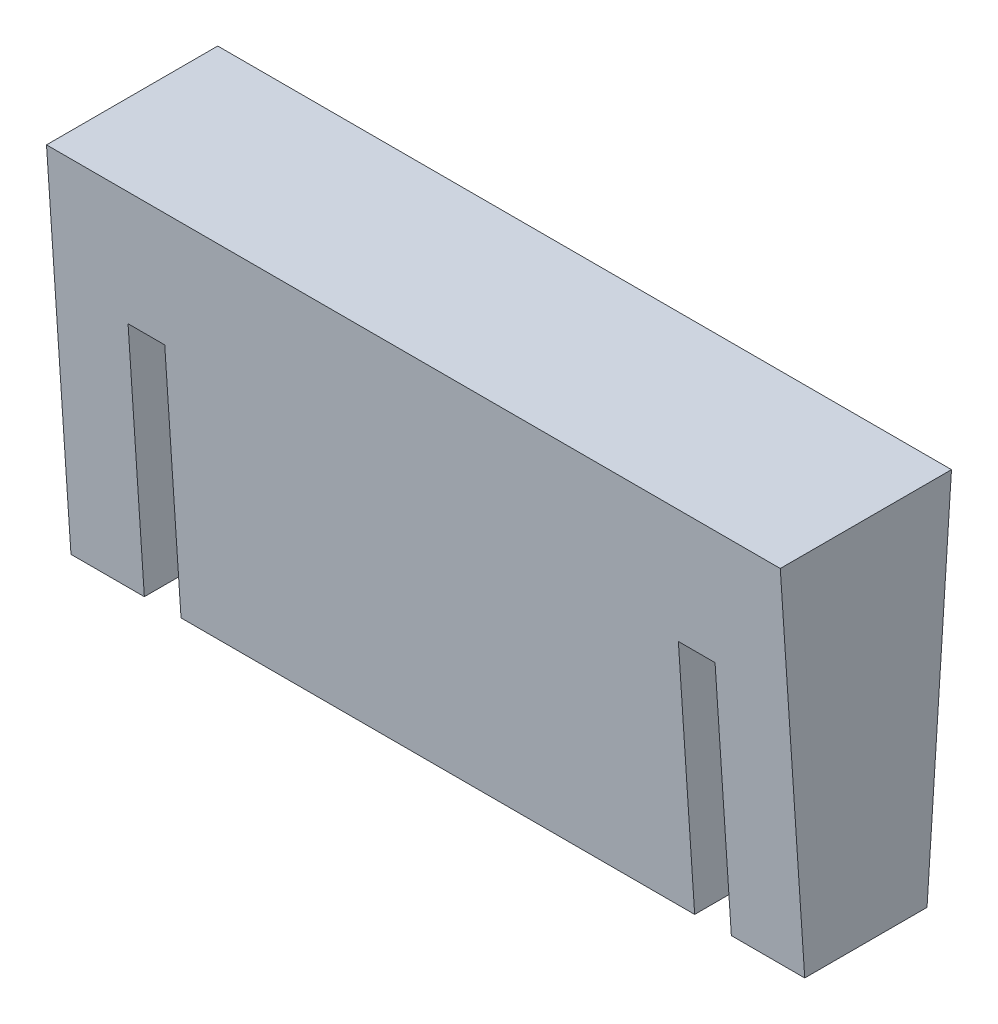
ISO-10303-21;
HEADER;
FILE_DESCRIPTION(('STEP AP214'),'2;1');
FILE_NAME('part.step','',(''),(''),'','','');
FILE_SCHEMA(('AUTOMOTIVE_DESIGN { 1 0 10303 214 1 1 1 1 }'));
ENDSEC;
DATA;
#1=APPLICATION_CONTEXT('core data for automotive mechanical design processes');
#2=APPLICATION_PROTOCOL_DEFINITION('international standard','automotive_design',2000,#1);
#3=PRODUCT_CONTEXT('',#1,'mechanical');
#4=PRODUCT('Part','Part','',(#3));
#5=PRODUCT_RELATED_PRODUCT_CATEGORY('part','',(#4));
#6=PRODUCT_DEFINITION_FORMATION('','',#4);
#7=PRODUCT_DEFINITION_CONTEXT('part definition',#1,'design');
#8=PRODUCT_DEFINITION('design','',#6,#7);
#9=PRODUCT_DEFINITION_SHAPE('','',#8);
#10=(LENGTH_UNIT() NAMED_UNIT(*) SI_UNIT(.MILLI.,.METRE.));
#11=(NAMED_UNIT(*) PLANE_ANGLE_UNIT() SI_UNIT($,.RADIAN.));
#12=(NAMED_UNIT(*) SI_UNIT($,.STERADIAN.) SOLID_ANGLE_UNIT());
#13=UNCERTAINTY_MEASURE_WITH_UNIT(LENGTH_MEASURE(1.E-05),#10,'distance_accuracy_value','');
#14=(GEOMETRIC_REPRESENTATION_CONTEXT(3) GLOBAL_UNCERTAINTY_ASSIGNED_CONTEXT((#13)) GLOBAL_UNIT_ASSIGNED_CONTEXT((#10,
#11,#12)) REPRESENTATION_CONTEXT('',''));
#15=CARTESIAN_POINT('',(0.,0.,0.));
#16=DIRECTION('',(0.,0.,1.));
#17=DIRECTION('',(1.,0.,0.));
#18=AXIS2_PLACEMENT_3D('',#15,#16,#17);
#19=CARTESIAN_POINT('',(0.,0.,0.));
#20=DIRECTION('',(0.,1.,0.));
#21=DIRECTION('',(0.,0.,1.));
#22=AXIS2_PLACEMENT_3D('',#19,#20,#21);
#23=PLANE('',#22);
#24=DIRECTION('',(0.,0.,1.));
#25=VECTOR('',#24,1.);
#26=CARTESIAN_POINT('',(-30.,0.,-7.));
#27=LINE('',#26,#25);
#28=CARTESIAN_POINT('',(-30.,0.,-5.));
#29=VERTEX_POINT('',#28);
#30=CARTESIAN_POINT('',(-30.,0.,5.00000000000001));
#31=VERTEX_POINT('',#30);
#32=EDGE_CURVE('E144',#29,#31,#27,.T.);
#33=ORIENTED_EDGE('',*,*,#32,.F.);
#34=DIRECTION('',(-1.,0.,0.));
#35=VECTOR('',#34,1.);
#36=CARTESIAN_POINT('',(30.,0.,-5.));
#37=LINE('',#36,#35);
#38=CARTESIAN_POINT('',(-24.,0.,-5.));
#39=VERTEX_POINT('',#38);
#40=EDGE_CURVE('E130',#39,#29,#37,.T.);
#41=ORIENTED_EDGE('',*,*,#40,.F.);
#42=DIRECTION('',(0.,0.,1.));
#43=VECTOR('',#42,1.);
#44=CARTESIAN_POINT('',(-24.,0.,-7.));
#45=LINE('',#44,#43);
#46=CARTESIAN_POINT('',(-24.,0.,5.00000000000001));
#47=VERTEX_POINT('',#46);
#48=EDGE_CURVE('E179',#39,#47,#45,.T.);
#49=ORIENTED_EDGE('',*,*,#48,.T.);
#50=DIRECTION('',(-1.,0.,0.));
#51=VECTOR('',#50,1.);
#52=CARTESIAN_POINT('',(30.,0.,5.00000000000001));
#53=LINE('',#52,#51);
#54=EDGE_CURVE('E214',#47,#31,#53,.T.);
#55=ORIENTED_EDGE('',*,*,#54,.T.);
#56=EDGE_LOOP('',(#33,#41,#49,#55));
#57=FACE_BOUND('',#56,.T.);
#58=ADVANCED_FACE('F33',(#57),#23,.F.);
#59=DIRECTION('',(0.,0.,1.));
#60=VECTOR('',#59,1.);
#61=CARTESIAN_POINT('',(24.,0.,-7.));
#62=LINE('',#61,#60);
#63=CARTESIAN_POINT('',(24.,0.,-5.));
#64=VERTEX_POINT('',#63);
#65=CARTESIAN_POINT('',(24.,0.,5.00000000000001));
#66=VERTEX_POINT('',#65);
#67=EDGE_CURVE('E140',#64,#66,#62,.T.);
#68=ORIENTED_EDGE('',*,*,#67,.F.);
#69=CARTESIAN_POINT('',(30.,0.,-5.));
#70=VERTEX_POINT('',#69);
#71=EDGE_CURVE('E122',#70,#64,#37,.T.);
#72=ORIENTED_EDGE('',*,*,#71,.F.);
#73=DIRECTION('',(0.,0.,-1.));
#74=VECTOR('',#73,1.);
#75=CARTESIAN_POINT('',(30.,0.,-7.));
#76=LINE('',#75,#74);
#77=CARTESIAN_POINT('',(30.,0.,5.00000000000001));
#78=VERTEX_POINT('',#77);
#79=EDGE_CURVE('E138',#78,#70,#76,.T.);
#80=ORIENTED_EDGE('',*,*,#79,.F.);
#81=EDGE_CURVE('E211',#78,#66,#53,.T.);
#82=ORIENTED_EDGE('',*,*,#81,.T.);
#83=EDGE_LOOP('',(#68,#72,#80,#82));
#84=FACE_BOUND('',#83,.T.);
#85=ADVANCED_FACE('F136',(#84),#23,.F.);
#86=CARTESIAN_POINT('',(30.,30.,-7.));
#87=DIRECTION('',(-1.,0.,0.));
#88=DIRECTION('',(0.,0.,1.));
#89=AXIS2_PLACEMENT_3D('',#86,#87,#88);
#90=PLANE('',#89);
#91=ORIENTED_EDGE('',*,*,#79,.T.);
#92=DIRECTION('',(0.,0.997785157856609,-0.0665190105237739));
#93=VECTOR('',#92,1.);
#94=CARTESIAN_POINT('',(30.,30.,-7.));
#95=LINE('',#94,#93);
#96=CARTESIAN_POINT('',(30.,30.,-7.));
#97=VERTEX_POINT('',#96);
#98=EDGE_CURVE('E119',#70,#97,#95,.T.);
#99=ORIENTED_EDGE('',*,*,#98,.T.);
#100=DIRECTION('',(0.,0.,-1.));
#101=VECTOR('',#100,1.);
#102=CARTESIAN_POINT('',(30.,30.,-7.));
#103=LINE('',#102,#101);
#104=CARTESIAN_POINT('',(30.,30.,7.));
#105=VERTEX_POINT('',#104);
#106=EDGE_CURVE('E148',#105,#97,#103,.T.);
#107=ORIENTED_EDGE('',*,*,#106,.F.);
#108=DIRECTION('',(0.,-0.997785157856609,-0.0665190105237737));
#109=VECTOR('',#108,1.);
#110=CARTESIAN_POINT('',(30.,30.,7.));
#111=LINE('',#110,#109);
#112=EDGE_CURVE('E143',#105,#78,#111,.T.);
#113=ORIENTED_EDGE('',*,*,#112,.T.);
#114=EDGE_LOOP('',(#91,#99,#107,#113));
#115=FACE_BOUND('',#114,.T.);
#116=ADVANCED_FACE('F35',(#115),#90,.F.);
#117=CARTESIAN_POINT('',(-30.,30.,-7.));
#118=DIRECTION('',(1.,0.,0.));
#119=DIRECTION('',(0.,0.,-1.));
#120=AXIS2_PLACEMENT_3D('',#117,#118,#119);
#121=PLANE('',#120);
#122=DIRECTION('',(0.,0.,1.));
#123=VECTOR('',#122,1.);
#124=CARTESIAN_POINT('',(-30.,30.,-7.));
#125=LINE('',#124,#123);
#126=CARTESIAN_POINT('',(-30.,30.,-7.));
#127=VERTEX_POINT('',#126);
#128=CARTESIAN_POINT('',(-30.,30.,7.));
#129=VERTEX_POINT('',#128);
#130=EDGE_CURVE('E161',#127,#129,#125,.T.);
#131=ORIENTED_EDGE('',*,*,#130,.F.);
#132=DIRECTION('',(0.,0.997785157856609,-0.0665190105237739));
#133=VECTOR('',#132,1.);
#134=CARTESIAN_POINT('',(-30.,30.,-7.));
#135=LINE('',#134,#133);
#136=EDGE_CURVE('E131',#29,#127,#135,.T.);
#137=ORIENTED_EDGE('',*,*,#136,.F.);
#138=ORIENTED_EDGE('',*,*,#32,.T.);
#139=DIRECTION('',(0.,-0.997785157856609,-0.0665190105237737));
#140=VECTOR('',#139,1.);
#141=CARTESIAN_POINT('',(-30.,30.,7.));
#142=LINE('',#141,#140);
#143=EDGE_CURVE('E215',#129,#31,#142,.T.);
#144=ORIENTED_EDGE('',*,*,#143,.F.);
#145=EDGE_LOOP('',(#131,#137,#138,#144));
#146=FACE_BOUND('',#145,.T.);
#147=ADVANCED_FACE('F224',(#146),#121,.F.);
#148=CARTESIAN_POINT('',(0.,30.,0.));
#149=DIRECTION('',(0.,1.,0.));
#150=DIRECTION('',(0.,0.,1.));
#151=AXIS2_PLACEMENT_3D('',#148,#149,#150);
#152=PLANE('',#151);
#153=ORIENTED_EDGE('',*,*,#106,.T.);
#154=DIRECTION('',(-1.,0.,0.));
#155=VECTOR('',#154,1.);
#156=CARTESIAN_POINT('',(-30.,30.,-7.));
#157=LINE('',#156,#155);
#158=EDGE_CURVE('E125',#97,#127,#157,.T.);
#159=ORIENTED_EDGE('',*,*,#158,.T.);
#160=ORIENTED_EDGE('',*,*,#130,.T.);
#161=DIRECTION('',(1.,0.,0.));
#162=VECTOR('',#161,1.);
#163=CARTESIAN_POINT('',(-30.,30.,7.));
#164=LINE('',#163,#162);
#165=EDGE_CURVE('E154',#129,#105,#164,.T.);
#166=ORIENTED_EDGE('',*,*,#165,.T.);
#167=EDGE_LOOP('',(#153,#159,#160,#166));
#168=FACE_BOUND('',#167,.T.);
#169=ADVANCED_FACE('F222',(#168),#152,.T.);
#170=DIRECTION('',(0.,0.,1.));
#171=VECTOR('',#170,1.);
#172=CARTESIAN_POINT('',(-21.,0.,-7.));
#173=LINE('',#172,#171);
#174=CARTESIAN_POINT('',(-21.,0.,-5.));
#175=VERTEX_POINT('',#174);
#176=CARTESIAN_POINT('',(-21.,0.,5.00000000000001));
#177=VERTEX_POINT('',#176);
#178=EDGE_CURVE('E182',#175,#177,#173,.T.);
#179=ORIENTED_EDGE('',*,*,#178,.F.);
#180=CARTESIAN_POINT('',(21.,0.,-5.));
#181=VERTEX_POINT('',#180);
#182=EDGE_CURVE('E48',#181,#175,#37,.T.);
#183=ORIENTED_EDGE('',*,*,#182,.F.);
#184=DIRECTION('',(0.,0.,1.));
#185=VECTOR('',#184,1.);
#186=CARTESIAN_POINT('',(21.,0.,-7.));
#187=LINE('',#186,#185);
#188=CARTESIAN_POINT('',(21.,0.,5.00000000000001));
#189=VERTEX_POINT('',#188);
#190=EDGE_CURVE('E175',#181,#189,#187,.T.);
#191=ORIENTED_EDGE('',*,*,#190,.T.);
#192=EDGE_CURVE('E213',#189,#177,#53,.T.);
#193=ORIENTED_EDGE('',*,*,#192,.T.);
#194=EDGE_LOOP('',(#179,#183,#191,#193));
#195=FACE_BOUND('',#194,.T.);
#196=ADVANCED_FACE('F232',(#195),#23,.F.);
#197=CARTESIAN_POINT('',(24.,0.,-7.));
#198=DIRECTION('',(1.,0.,0.));
#199=DIRECTION('',(0.,1.,0.));
#200=AXIS2_PLACEMENT_3D('',#197,#198,#199);
#201=PLANE('',#200);
#202=DIRECTION('',(0.,0.,1.));
#203=VECTOR('',#202,1.);
#204=CARTESIAN_POINT('',(24.,20.,-7.));
#205=LINE('',#204,#203);
#206=CARTESIAN_POINT('',(24.,20.,-6.33333333333333));
#207=VERTEX_POINT('',#206);
#208=CARTESIAN_POINT('',(24.,20.,6.33333333333334));
#209=VERTEX_POINT('',#208);
#210=EDGE_CURVE('E168',#207,#209,#205,.T.);
#211=ORIENTED_EDGE('',*,*,#210,.F.);
#212=DIRECTION('',(0.,-0.997785157856609,0.066519010523774));
#213=VECTOR('',#212,1.);
#214=CARTESIAN_POINT('',(24.,0.132743362831864,-5.00884955752212));
#215=LINE('',#214,#213);
#216=EDGE_CURVE('E172',#207,#64,#215,.T.);
#217=ORIENTED_EDGE('',*,*,#216,.T.);
#218=ORIENTED_EDGE('',*,*,#67,.T.);
#219=DIRECTION('',(0.,0.997785157856609,0.0665190105237737));
#220=VECTOR('',#219,1.);
#221=CARTESIAN_POINT('',(24.,-0.796460176991142,4.94690265486726));
#222=LINE('',#221,#220);
#223=EDGE_CURVE('E198',#66,#209,#222,.T.);
#224=ORIENTED_EDGE('',*,*,#223,.T.);
#225=EDGE_LOOP('',(#211,#217,#218,#224));
#226=FACE_BOUND('',#225,.T.);
#227=ADVANCED_FACE('F260',(#226),#201,.F.);
#228=CARTESIAN_POINT('',(21.,0.,-7.));
#229=DIRECTION('',(-1.,0.,0.));
#230=DIRECTION('',(0.,-1.,0.));
#231=AXIS2_PLACEMENT_3D('',#228,#229,#230);
#232=PLANE('',#231);
#233=ORIENTED_EDGE('',*,*,#190,.F.);
#234=DIRECTION('',(0.,0.997785157856609,-0.066519010523774));
#235=VECTOR('',#234,1.);
#236=CARTESIAN_POINT('',(21.,0.132743362831864,-5.00884955752212));
#237=LINE('',#236,#235);
#238=CARTESIAN_POINT('',(21.,20.,-6.33333333333333));
#239=VERTEX_POINT('',#238);
#240=EDGE_CURVE('E186',#181,#239,#237,.T.);
#241=ORIENTED_EDGE('',*,*,#240,.T.);
#242=DIRECTION('',(0.,0.,1.));
#243=VECTOR('',#242,1.);
#244=CARTESIAN_POINT('',(21.,20.,-7.));
#245=LINE('',#244,#243);
#246=CARTESIAN_POINT('',(21.,20.,6.33333333333334));
#247=VERTEX_POINT('',#246);
#248=EDGE_CURVE('E171',#239,#247,#245,.T.);
#249=ORIENTED_EDGE('',*,*,#248,.T.);
#250=DIRECTION('',(0.,-0.997785157856609,-0.0665190105237737));
#251=VECTOR('',#250,1.);
#252=CARTESIAN_POINT('',(21.,-0.796460176991143,4.94690265486726));
#253=LINE('',#252,#251);
#254=EDGE_CURVE('E201',#247,#189,#253,.T.);
#255=ORIENTED_EDGE('',*,*,#254,.T.);
#256=EDGE_LOOP('',(#233,#241,#249,#255));
#257=FACE_BOUND('',#256,.T.);
#258=ADVANCED_FACE('F248',(#257),#232,.F.);
#259=CARTESIAN_POINT('',(24.,20.,-7.));
#260=DIRECTION('',(0.,1.,0.));
#261=DIRECTION('',(-1.,0.,0.));
#262=AXIS2_PLACEMENT_3D('',#259,#260,#261);
#263=PLANE('',#262);
#264=ORIENTED_EDGE('',*,*,#248,.F.);
#265=DIRECTION('',(1.,0.,0.));
#266=VECTOR('',#265,1.);
#267=CARTESIAN_POINT('',(24.,20.,-6.33333333333333));
#268=LINE('',#267,#266);
#269=EDGE_CURVE('E189',#239,#207,#268,.T.);
#270=ORIENTED_EDGE('',*,*,#269,.T.);
#271=ORIENTED_EDGE('',*,*,#210,.T.);
#272=DIRECTION('',(-1.,0.,0.));
#273=VECTOR('',#272,1.);
#274=CARTESIAN_POINT('',(24.,20.,6.33333333333334));
#275=LINE('',#274,#273);
#276=EDGE_CURVE('E204',#209,#247,#275,.T.);
#277=ORIENTED_EDGE('',*,*,#276,.T.);
#278=EDGE_LOOP('',(#264,#270,#271,#277));
#279=FACE_BOUND('',#278,.T.);
#280=ADVANCED_FACE('F241',(#279),#263,.F.);
#281=CARTESIAN_POINT('',(-24.,0.,-7.));
#282=DIRECTION('',(-1.,0.,0.));
#283=DIRECTION('',(0.,0.,1.));
#284=AXIS2_PLACEMENT_3D('',#281,#282,#283);
#285=PLANE('',#284);
#286=ORIENTED_EDGE('',*,*,#48,.F.);
#287=DIRECTION('',(0.,0.997785157856609,-0.066519010523774));
#288=VECTOR('',#287,1.);
#289=CARTESIAN_POINT('',(-24.,0.132743362831858,-5.00884955752212));
#290=LINE('',#289,#288);
#291=CARTESIAN_POINT('',(-24.,20.,-6.33333333333333));
#292=VERTEX_POINT('',#291);
#293=EDGE_CURVE('E192',#39,#292,#290,.T.);
#294=ORIENTED_EDGE('',*,*,#293,.T.);
#295=DIRECTION('',(0.,0.,1.));
#296=VECTOR('',#295,1.);
#297=CARTESIAN_POINT('',(-24.,20.,-7.));
#298=LINE('',#297,#296);
#299=CARTESIAN_POINT('',(-24.,20.,6.33333333333334));
#300=VERTEX_POINT('',#299);
#301=EDGE_CURVE('E145',#292,#300,#298,.T.);
#302=ORIENTED_EDGE('',*,*,#301,.T.);
#303=DIRECTION('',(0.,-0.997785157856609,-0.0665190105237737));
#304=VECTOR('',#303,1.);
#305=CARTESIAN_POINT('',(-24.,-0.796460176991148,4.94690265486726));
#306=LINE('',#305,#304);
#307=EDGE_CURVE('E207',#300,#47,#306,.T.);
#308=ORIENTED_EDGE('',*,*,#307,.T.);
#309=EDGE_LOOP('',(#286,#294,#302,#308));
#310=FACE_BOUND('',#309,.T.);
#311=ADVANCED_FACE('F239',(#310),#285,.F.);
#312=CARTESIAN_POINT('',(-24.,20.,-7.));
#313=DIRECTION('',(0.,1.,0.));
#314=DIRECTION('',(0.,0.,1.));
#315=AXIS2_PLACEMENT_3D('',#312,#313,#314);
#316=PLANE('',#315);
#317=ORIENTED_EDGE('',*,*,#301,.F.);
#318=DIRECTION('',(1.,0.,0.));
#319=VECTOR('',#318,1.);
#320=CARTESIAN_POINT('',(-24.,20.,-6.33333333333333));
#321=LINE('',#320,#319);
#322=CARTESIAN_POINT('',(-21.,20.,-6.33333333333333));
#323=VERTEX_POINT('',#322);
#324=EDGE_CURVE('E195',#292,#323,#321,.T.);
#325=ORIENTED_EDGE('',*,*,#324,.T.);
#326=DIRECTION('',(0.,0.,1.));
#327=VECTOR('',#326,1.);
#328=CARTESIAN_POINT('',(-21.,20.,-7.));
#329=LINE('',#328,#327);
#330=CARTESIAN_POINT('',(-21.,20.,6.33333333333333));
#331=VERTEX_POINT('',#330);
#332=EDGE_CURVE('E151',#323,#331,#329,.T.);
#333=ORIENTED_EDGE('',*,*,#332,.T.);
#334=DIRECTION('',(-1.,0.,0.));
#335=VECTOR('',#334,1.);
#336=CARTESIAN_POINT('',(-24.,20.,6.33333333333334));
#337=LINE('',#336,#335);
#338=EDGE_CURVE('E55',#331,#300,#337,.T.);
#339=ORIENTED_EDGE('',*,*,#338,.T.);
#340=EDGE_LOOP('',(#317,#325,#333,#339));
#341=FACE_BOUND('',#340,.T.);
#342=ADVANCED_FACE('F237',(#341),#316,.F.);
#343=CARTESIAN_POINT('',(-21.,0.,-7.));
#344=DIRECTION('',(1.,0.,0.));
#345=DIRECTION('',(0.,0.,-1.));
#346=AXIS2_PLACEMENT_3D('',#343,#344,#345);
#347=PLANE('',#346);
#348=ORIENTED_EDGE('',*,*,#332,.F.);
#349=DIRECTION('',(0.,-0.997785157856609,0.066519010523774));
#350=VECTOR('',#349,1.);
#351=CARTESIAN_POINT('',(-21.,0.132743362831858,-5.00884955752212));
#352=LINE('',#351,#350);
#353=EDGE_CURVE('E11',#323,#175,#352,.T.);
#354=ORIENTED_EDGE('',*,*,#353,.T.);
#355=ORIENTED_EDGE('',*,*,#178,.T.);
#356=DIRECTION('',(0.,0.997785157856609,0.0665190105237737));
#357=VECTOR('',#356,1.);
#358=CARTESIAN_POINT('',(-21.,-0.796460176991148,4.94690265486726));
#359=LINE('',#358,#357);
#360=EDGE_CURVE('E41',#177,#331,#359,.T.);
#361=ORIENTED_EDGE('',*,*,#360,.T.);
#362=EDGE_LOOP('',(#348,#354,#355,#361));
#363=FACE_BOUND('',#362,.T.);
#364=ADVANCED_FACE('F234',(#363),#347,.F.);
#365=CARTESIAN_POINT('',(30.,30.,7.));
#366=DIRECTION('',(0.,0.0665190105237737,-0.997785157856609));
#367=DIRECTION('',(0.,0.997785157856609,0.0665190105237737));
#368=AXIS2_PLACEMENT_3D('',#365,#366,#367);
#369=PLANE('',#368);
#370=ORIENTED_EDGE('',*,*,#81,.F.);
#371=ORIENTED_EDGE('',*,*,#112,.F.);
#372=ORIENTED_EDGE('',*,*,#165,.F.);
#373=ORIENTED_EDGE('',*,*,#143,.T.);
#374=ORIENTED_EDGE('',*,*,#54,.F.);
#375=ORIENTED_EDGE('',*,*,#307,.F.);
#376=ORIENTED_EDGE('',*,*,#338,.F.);
#377=ORIENTED_EDGE('',*,*,#360,.F.);
#378=ORIENTED_EDGE('',*,*,#192,.F.);
#379=ORIENTED_EDGE('',*,*,#254,.F.);
#380=ORIENTED_EDGE('',*,*,#276,.F.);
#381=ORIENTED_EDGE('',*,*,#223,.F.);
#382=EDGE_LOOP('',(#370,#371,#372,#373,#374,#375,#376,#377,#378,#379,#380,#381));
#383=FACE_BOUND('',#382,.T.);
#384=ADVANCED_FACE('F226',(#383),#369,.F.);
#385=CARTESIAN_POINT('',(30.,30.,-7.));
#386=DIRECTION('',(0.,0.0665190105237739,0.997785157856609));
#387=DIRECTION('',(0.,-0.997785157856609,0.0665190105237739));
#388=AXIS2_PLACEMENT_3D('',#385,#386,#387);
#389=PLANE('',#388);
#390=ORIENTED_EDGE('',*,*,#269,.F.);
#391=ORIENTED_EDGE('',*,*,#240,.F.);
#392=ORIENTED_EDGE('',*,*,#182,.T.);
#393=ORIENTED_EDGE('',*,*,#353,.F.);
#394=ORIENTED_EDGE('',*,*,#324,.F.);
#395=ORIENTED_EDGE('',*,*,#293,.F.);
#396=ORIENTED_EDGE('',*,*,#40,.T.);
#397=ORIENTED_EDGE('',*,*,#136,.T.);
#398=ORIENTED_EDGE('',*,*,#158,.F.);
#399=ORIENTED_EDGE('',*,*,#98,.F.);
#400=ORIENTED_EDGE('',*,*,#71,.T.);
#401=ORIENTED_EDGE('',*,*,#216,.F.);
#402=EDGE_LOOP('',(#390,#391,#392,#393,#394,#395,#396,#397,#398,#399,#400,#401));
#403=FACE_BOUND('',#402,.T.);
#404=ADVANCED_FACE('F121',(#403),#389,.F.);
#405=CLOSED_SHELL('',(#58,#85,#116,#147,#169,#196,#227,#258,#280,#311,#342,#364,#384,#404));
#406=MANIFOLD_SOLID_BREP('B2',#405);
#407=ADVANCED_BREP_SHAPE_REPRESENTATION('',(#18,#406),#14);
#408=SHAPE_DEFINITION_REPRESENTATION(#9,#407);
ENDSEC;
END-ISO-10303-21;
